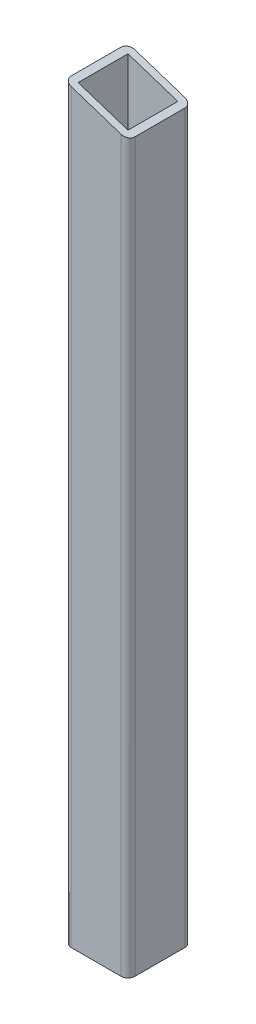
ISO-10303-21;
HEADER;
FILE_DESCRIPTION(('STEP AP214'),'2;1');
FILE_NAME('part.step','',(''),(''),'','','');
FILE_SCHEMA(('AUTOMOTIVE_DESIGN { 1 0 10303 214 1 1 1 1 }'));
ENDSEC;
DATA;
#1=APPLICATION_CONTEXT('core data for automotive mechanical design processes');
#2=APPLICATION_PROTOCOL_DEFINITION('international standard','automotive_design',2000,#1);
#3=PRODUCT_CONTEXT('',#1,'mechanical');
#4=PRODUCT('Part','Part','',(#3));
#5=PRODUCT_RELATED_PRODUCT_CATEGORY('part','',(#4));
#6=PRODUCT_DEFINITION_FORMATION('','',#4);
#7=PRODUCT_DEFINITION_CONTEXT('part definition',#1,'design');
#8=PRODUCT_DEFINITION('design','',#6,#7);
#9=PRODUCT_DEFINITION_SHAPE('','',#8);
#10=(LENGTH_UNIT() NAMED_UNIT(*) SI_UNIT(.MILLI.,.METRE.));
#11=(NAMED_UNIT(*) PLANE_ANGLE_UNIT() SI_UNIT($,.RADIAN.));
#12=(NAMED_UNIT(*) SI_UNIT($,.STERADIAN.) SOLID_ANGLE_UNIT());
#13=UNCERTAINTY_MEASURE_WITH_UNIT(LENGTH_MEASURE(1.E-05),#10,'distance_accuracy_value','');
#14=(GEOMETRIC_REPRESENTATION_CONTEXT(3) GLOBAL_UNCERTAINTY_ASSIGNED_CONTEXT((#13)) GLOBAL_UNIT_ASSIGNED_CONTEXT((#10,
#11,#12)) REPRESENTATION_CONTEXT('',''));
#15=CARTESIAN_POINT('',(0.,0.,0.));
#16=DIRECTION('',(0.,0.,1.));
#17=DIRECTION('',(1.,0.,0.));
#18=AXIS2_PLACEMENT_3D('',#15,#16,#17);
#19=CARTESIAN_POINT('',(22.8,300.25,2.8));
#20=DIRECTION('',(0.,-1.,0.));
#21=DIRECTION('',(0.,0.,-1.));
#22=AXIS2_PLACEMENT_3D('',#19,#20,#21);
#23=CYLINDRICAL_SURFACE('',#22,2.8);
#24=CARTESIAN_POINT('',(22.8,292.780189397286,2.8));
#25=DIRECTION('',(0.311339939031227,0.950298606946276,0.));
#26=DIRECTION('',(0.950298606946276,-0.311339939031227,0.));
#27=AXIS2_PLACEMENT_3D('',#24,#25,#26);
#28=ELLIPSE('',#27,2.94644228617531,2.8);
#29=CARTESIAN_POINT('',(25.6,291.862844235549,2.80000000000002));
#30=VERTEX_POINT('',#29);
#31=CARTESIAN_POINT('',(22.8,292.780189397286,0.));
#32=VERTEX_POINT('',#31);
#33=EDGE_CURVE('E190',#30,#32,#28,.T.);
#34=ORIENTED_EDGE('',*,*,#33,.F.);
#35=DIRECTION('',(0.,-1.,0.));
#36=VECTOR('',#35,1.);
#37=CARTESIAN_POINT('',(25.6,300.25,2.80000000000002));
#38=LINE('',#37,#36);
#39=CARTESIAN_POINT('',(25.6,0.,2.80000000000002));
#40=VERTEX_POINT('',#39);
#41=EDGE_CURVE('E145',#30,#40,#38,.T.);
#42=ORIENTED_EDGE('',*,*,#41,.T.);
#43=CARTESIAN_POINT('',(22.8,0.,2.8));
#44=DIRECTION('',(0.,1.,0.));
#45=DIRECTION('',(0.,0.,-1.));
#46=AXIS2_PLACEMENT_3D('',#43,#44,#45);
#47=CIRCLE('',#46,2.8);
#48=CARTESIAN_POINT('',(22.8,0.,0.));
#49=VERTEX_POINT('',#48);
#50=EDGE_CURVE('E157',#40,#49,#47,.T.);
#51=ORIENTED_EDGE('',*,*,#50,.T.);
#52=DIRECTION('',(0.,-1.,0.));
#53=VECTOR('',#52,1.);
#54=CARTESIAN_POINT('',(22.8,300.25,0.));
#55=LINE('',#54,#53);
#56=EDGE_CURVE('E40',#32,#49,#55,.T.);
#57=ORIENTED_EDGE('',*,*,#56,.F.);
#58=EDGE_LOOP('',(#34,#42,#51,#57));
#59=FACE_BOUND('',#58,.T.);
#60=ADVANCED_FACE('F33',(#59),#23,.T.);
#61=CARTESIAN_POINT('',(2.80000000000002,300.25,0.));
#62=DIRECTION('',(0.,0.,1.));
#63=DIRECTION('',(1.,0.,0.));
#64=AXIS2_PLACEMENT_3D('',#61,#62,#63);
#65=PLANE('',#64);
#66=DIRECTION('',(-0.950298606946276,0.311339939031227,0.));
#67=VECTOR('',#66,1.);
#68=CARTESIAN_POINT('',(2.52858883861931,299.421575451025,0.));
#69=LINE('',#68,#67);
#70=CARTESIAN_POINT('',(2.80000000000002,299.332654838263,0.));
#71=VERTEX_POINT('',#70);
#72=EDGE_CURVE('E47',#32,#71,#69,.T.);
#73=ORIENTED_EDGE('',*,*,#72,.F.);
#74=ORIENTED_EDGE('',*,*,#56,.T.);
#75=DIRECTION('',(-1.,0.,0.));
#76=VECTOR('',#75,1.);
#77=CARTESIAN_POINT('',(2.80000000000002,0.,0.));
#78=LINE('',#77,#76);
#79=CARTESIAN_POINT('',(2.80000000000002,0.,0.));
#80=VERTEX_POINT('',#79);
#81=EDGE_CURVE('E160',#49,#80,#78,.T.);
#82=ORIENTED_EDGE('',*,*,#81,.T.);
#83=DIRECTION('',(0.,-1.,0.));
#84=VECTOR('',#83,1.);
#85=CARTESIAN_POINT('',(2.80000000000002,300.25,0.));
#86=LINE('',#85,#84);
#87=EDGE_CURVE('E179',#71,#80,#86,.T.);
#88=ORIENTED_EDGE('',*,*,#87,.F.);
#89=EDGE_LOOP('',(#73,#74,#82,#88));
#90=FACE_BOUND('',#89,.T.);
#91=ADVANCED_FACE('F181',(#90),#65,.F.);
#92=CARTESIAN_POINT('',(2.8,300.25,2.8));
#93=DIRECTION('',(0.,-1.,0.));
#94=DIRECTION('',(0.,0.,-1.));
#95=AXIS2_PLACEMENT_3D('',#92,#93,#94);
#96=CYLINDRICAL_SURFACE('',#95,2.8);
#97=CARTESIAN_POINT('',(2.8,299.332654838263,2.8));
#98=DIRECTION('',(0.311339939031227,0.950298606946276,0.));
#99=DIRECTION('',(0.950298606946276,-0.311339939031227,0.));
#100=AXIS2_PLACEMENT_3D('',#97,#98,#99);
#101=ELLIPSE('',#100,2.94644228617531,2.8);
#102=CARTESIAN_POINT('',(0.,300.25,2.80000000000002));
#103=VERTEX_POINT('',#102);
#104=EDGE_CURVE('E55',#71,#103,#101,.T.);
#105=ORIENTED_EDGE('',*,*,#104,.F.);
#106=ORIENTED_EDGE('',*,*,#87,.T.);
#107=CARTESIAN_POINT('',(2.8,0.,2.8));
#108=DIRECTION('',(0.,1.,0.));
#109=DIRECTION('',(0.,0.,1.));
#110=AXIS2_PLACEMENT_3D('',#107,#108,#109);
#111=CIRCLE('',#110,2.8);
#112=CARTESIAN_POINT('',(0.,0.,2.80000000000002));
#113=VERTEX_POINT('',#112);
#114=EDGE_CURVE('E164',#80,#113,#111,.T.);
#115=ORIENTED_EDGE('',*,*,#114,.T.);
#116=DIRECTION('',(0.,-1.,0.));
#117=VECTOR('',#116,1.);
#118=CARTESIAN_POINT('',(0.,300.25,2.80000000000002));
#119=LINE('',#118,#117);
#120=EDGE_CURVE('E132',#103,#113,#119,.T.);
#121=ORIENTED_EDGE('',*,*,#120,.F.);
#122=EDGE_LOOP('',(#105,#106,#115,#121));
#123=FACE_BOUND('',#122,.T.);
#124=ADVANCED_FACE('F266',(#123),#96,.T.);
#125=CARTESIAN_POINT('',(2.8,300.25,22.8));
#126=DIRECTION('',(0.,-1.,0.));
#127=DIRECTION('',(0.,0.,-1.));
#128=AXIS2_PLACEMENT_3D('',#125,#126,#127);
#129=CYLINDRICAL_SURFACE('',#128,2.8);
#130=CARTESIAN_POINT('',(2.8,299.332654838263,22.8));
#131=DIRECTION('',(0.311339939031227,0.950298606946276,0.));
#132=DIRECTION('',(0.950298606946276,-0.311339939031227,0.));
#133=AXIS2_PLACEMENT_3D('',#130,#131,#132);
#134=ELLIPSE('',#133,2.94644228617531,2.8);
#135=CARTESIAN_POINT('',(0.,300.25,22.8));
#136=VERTEX_POINT('',#135);
#137=CARTESIAN_POINT('',(2.80000000000002,299.332654838263,25.6));
#138=VERTEX_POINT('',#137);
#139=EDGE_CURVE('E137',#136,#138,#134,.T.);
#140=ORIENTED_EDGE('',*,*,#139,.F.);
#141=DIRECTION('',(0.,-1.,0.));
#142=VECTOR('',#141,1.);
#143=CARTESIAN_POINT('',(0.,300.25,22.8));
#144=LINE('',#143,#142);
#145=CARTESIAN_POINT('',(0.,0.,22.8));
#146=VERTEX_POINT('',#145);
#147=EDGE_CURVE('E121',#136,#146,#144,.T.);
#148=ORIENTED_EDGE('',*,*,#147,.T.);
#149=CARTESIAN_POINT('',(2.8,0.,22.8));
#150=DIRECTION('',(0.,1.,0.));
#151=DIRECTION('',(0.,0.,1.));
#152=AXIS2_PLACEMENT_3D('',#149,#150,#151);
#153=CIRCLE('',#152,2.8);
#154=CARTESIAN_POINT('',(2.80000000000002,0.,25.6));
#155=VERTEX_POINT('',#154);
#156=EDGE_CURVE('E167',#146,#155,#153,.T.);
#157=ORIENTED_EDGE('',*,*,#156,.T.);
#158=DIRECTION('',(0.,-1.,0.));
#159=VECTOR('',#158,1.);
#160=CARTESIAN_POINT('',(2.80000000000002,300.25,25.6));
#161=LINE('',#160,#159);
#162=EDGE_CURVE('E133',#138,#155,#161,.T.);
#163=ORIENTED_EDGE('',*,*,#162,.F.);
#164=EDGE_LOOP('',(#140,#148,#157,#163));
#165=FACE_BOUND('',#164,.T.);
#166=ADVANCED_FACE('F138',(#165),#129,.T.);
#167=CARTESIAN_POINT('',(2.80000000000002,300.25,25.6));
#168=DIRECTION('',(0.,0.,-1.));
#169=DIRECTION('',(-1.,0.,0.));
#170=AXIS2_PLACEMENT_3D('',#167,#168,#169);
#171=PLANE('',#170);
#172=DIRECTION('',(0.950298606946276,-0.311339939031227,0.));
#173=VECTOR('',#172,1.);
#174=CARTESIAN_POINT('',(2.52858883861931,299.421575451025,25.6));
#175=LINE('',#174,#173);
#176=CARTESIAN_POINT('',(22.8,292.780189397286,25.6));
#177=VERTEX_POINT('',#176);
#178=EDGE_CURVE('E141',#138,#177,#175,.T.);
#179=ORIENTED_EDGE('',*,*,#178,.F.);
#180=ORIENTED_EDGE('',*,*,#162,.T.);
#181=DIRECTION('',(1.,0.,0.));
#182=VECTOR('',#181,1.);
#183=CARTESIAN_POINT('',(2.80000000000002,0.,25.6));
#184=LINE('',#183,#182);
#185=CARTESIAN_POINT('',(22.8,0.,25.6));
#186=VERTEX_POINT('',#185);
#187=EDGE_CURVE('E169',#155,#186,#184,.T.);
#188=ORIENTED_EDGE('',*,*,#187,.T.);
#189=DIRECTION('',(0.,-1.,0.));
#190=VECTOR('',#189,1.);
#191=CARTESIAN_POINT('',(22.8,300.25,25.6));
#192=LINE('',#191,#190);
#193=EDGE_CURVE('E175',#177,#186,#192,.T.);
#194=ORIENTED_EDGE('',*,*,#193,.F.);
#195=EDGE_LOOP('',(#179,#180,#188,#194));
#196=FACE_BOUND('',#195,.T.);
#197=ADVANCED_FACE('F202',(#196),#171,.F.);
#198=CARTESIAN_POINT('',(22.8,300.25,22.8));
#199=DIRECTION('',(0.,-1.,0.));
#200=DIRECTION('',(0.,0.,-1.));
#201=AXIS2_PLACEMENT_3D('',#198,#199,#200);
#202=CYLINDRICAL_SURFACE('',#201,2.8);
#203=CARTESIAN_POINT('',(22.8,292.780189397286,22.8));
#204=DIRECTION('',(0.311339939031227,0.950298606946276,0.));
#205=DIRECTION('',(0.950298606946276,-0.311339939031227,0.));
#206=AXIS2_PLACEMENT_3D('',#203,#204,#205);
#207=ELLIPSE('',#206,2.94644228617531,2.8);
#208=CARTESIAN_POINT('',(25.6,291.862844235549,22.8));
#209=VERTEX_POINT('',#208);
#210=EDGE_CURVE('E200',#177,#209,#207,.T.);
#211=ORIENTED_EDGE('',*,*,#210,.F.);
#212=ORIENTED_EDGE('',*,*,#193,.T.);
#213=CARTESIAN_POINT('',(22.8,0.,22.8));
#214=DIRECTION('',(0.,1.,0.));
#215=DIRECTION('',(0.,0.,1.));
#216=AXIS2_PLACEMENT_3D('',#213,#214,#215);
#217=CIRCLE('',#216,2.8);
#218=CARTESIAN_POINT('',(25.6,0.,22.8));
#219=VERTEX_POINT('',#218);
#220=EDGE_CURVE('E151',#186,#219,#217,.T.);
#221=ORIENTED_EDGE('',*,*,#220,.T.);
#222=DIRECTION('',(0.,-1.,0.));
#223=VECTOR('',#222,1.);
#224=CARTESIAN_POINT('',(25.6,300.25,22.8));
#225=LINE('',#224,#223);
#226=EDGE_CURVE('E148',#209,#219,#225,.T.);
#227=ORIENTED_EDGE('',*,*,#226,.F.);
#228=EDGE_LOOP('',(#211,#212,#221,#227));
#229=FACE_BOUND('',#228,.T.);
#230=ADVANCED_FACE('F197',(#229),#202,.T.);
#231=CARTESIAN_POINT('',(25.6,300.25,2.80000000000002));
#232=DIRECTION('',(-1.,0.,0.));
#233=DIRECTION('',(0.,0.,1.));
#234=AXIS2_PLACEMENT_3D('',#231,#232,#233);
#235=PLANE('',#234);
#236=DIRECTION('',(0.,0.,-1.));
#237=VECTOR('',#236,1.);
#238=CARTESIAN_POINT('',(25.6,291.862844235549,429.331047212064));
#239=LINE('',#238,#237);
#240=EDGE_CURVE('E248',#209,#30,#239,.T.);
#241=ORIENTED_EDGE('',*,*,#240,.F.);
#242=ORIENTED_EDGE('',*,*,#226,.T.);
#243=DIRECTION('',(0.,0.,-1.));
#244=VECTOR('',#243,1.);
#245=CARTESIAN_POINT('',(25.6,0.,2.80000000000002));
#246=LINE('',#245,#244);
#247=EDGE_CURVE('E146',#219,#40,#246,.T.);
#248=ORIENTED_EDGE('',*,*,#247,.T.);
#249=ORIENTED_EDGE('',*,*,#41,.F.);
#250=EDGE_LOOP('',(#241,#242,#248,#249));
#251=FACE_BOUND('',#250,.T.);
#252=ADVANCED_FACE('F192',(#251),#235,.F.);
#253=CARTESIAN_POINT('',(22.8,1040.5,2.8));
#254=DIRECTION('',(1.,0.,0.));
#255=DIRECTION('',(0.,0.,-1.));
#256=AXIS2_PLACEMENT_3D('',#253,#254,#255);
#257=PLANE('',#256);
#258=DIRECTION('',(0.,0.,1.));
#259=VECTOR('',#258,1.);
#260=CARTESIAN_POINT('',(22.8,292.780189397286,2.80000000000008));
#261=LINE('',#260,#259);
#262=CARTESIAN_POINT('',(22.8,292.780189397286,2.8));
#263=VERTEX_POINT('',#262);
#264=CARTESIAN_POINT('',(22.8,292.780189397286,22.8));
#265=VERTEX_POINT('',#264);
#266=EDGE_CURVE('E204',#263,#265,#261,.T.);
#267=ORIENTED_EDGE('',*,*,#266,.F.);
#268=DIRECTION('',(0.,-1.,0.));
#269=VECTOR('',#268,1.);
#270=CARTESIAN_POINT('',(22.8,1040.5,2.8));
#271=LINE('',#270,#269);
#272=CARTESIAN_POINT('',(22.8,0.,2.8));
#273=VERTEX_POINT('',#272);
#274=EDGE_CURVE('E161',#263,#273,#271,.T.);
#275=ORIENTED_EDGE('',*,*,#274,.T.);
#276=DIRECTION('',(0.,0.,1.));
#277=VECTOR('',#276,1.);
#278=CARTESIAN_POINT('',(22.8,0.,2.8));
#279=LINE('',#278,#277);
#280=CARTESIAN_POINT('',(22.8,0.,22.8));
#281=VERTEX_POINT('',#280);
#282=EDGE_CURVE('E211',#273,#281,#279,.T.);
#283=ORIENTED_EDGE('',*,*,#282,.T.);
#284=DIRECTION('',(0.,-1.,0.));
#285=VECTOR('',#284,1.);
#286=CARTESIAN_POINT('',(22.8,1040.5,22.8));
#287=LINE('',#286,#285);
#288=EDGE_CURVE('E155',#265,#281,#287,.T.);
#289=ORIENTED_EDGE('',*,*,#288,.F.);
#290=EDGE_LOOP('',(#267,#275,#283,#289));
#291=FACE_BOUND('',#290,.T.);
#292=ADVANCED_FACE('F236',(#291),#257,.F.);
#293=CARTESIAN_POINT('',(2.8,1040.5,2.8));
#294=DIRECTION('',(0.,0.,-1.));
#295=DIRECTION('',(-1.,0.,0.));
#296=AXIS2_PLACEMENT_3D('',#293,#294,#295);
#297=PLANE('',#296);
#298=DIRECTION('',(0.950298606946276,-0.311339939031227,0.));
#299=VECTOR('',#298,1.);
#300=CARTESIAN_POINT('',(-216.486151296571,371.175901241051,2.79999999999996));
#301=LINE('',#300,#299);
#302=CARTESIAN_POINT('',(2.8,299.332654838263,2.8));
#303=VERTEX_POINT('',#302);
#304=EDGE_CURVE('E247',#303,#263,#301,.T.);
#305=ORIENTED_EDGE('',*,*,#304,.F.);
#306=DIRECTION('',(0.,-1.,0.));
#307=VECTOR('',#306,1.);
#308=CARTESIAN_POINT('',(2.8,1040.5,2.8));
#309=LINE('',#308,#307);
#310=CARTESIAN_POINT('',(2.8,0.,2.8));
#311=VERTEX_POINT('',#310);
#312=EDGE_CURVE('E224',#303,#311,#309,.T.);
#313=ORIENTED_EDGE('',*,*,#312,.T.);
#314=DIRECTION('',(1.,0.,0.));
#315=VECTOR('',#314,1.);
#316=CARTESIAN_POINT('',(2.8,0.,2.8));
#317=LINE('',#316,#315);
#318=EDGE_CURVE('E220',#311,#273,#317,.T.);
#319=ORIENTED_EDGE('',*,*,#318,.T.);
#320=ORIENTED_EDGE('',*,*,#274,.F.);
#321=EDGE_LOOP('',(#305,#313,#319,#320));
#322=FACE_BOUND('',#321,.T.);
#323=ADVANCED_FACE('F252',(#322),#297,.F.);
#324=CARTESIAN_POINT('',(2.8,1040.5,2.8));
#325=DIRECTION('',(-1.,0.,0.));
#326=DIRECTION('',(0.,0.,1.));
#327=AXIS2_PLACEMENT_3D('',#324,#325,#326);
#328=PLANE('',#327);
#329=DIRECTION('',(0.,0.,-1.));
#330=VECTOR('',#329,1.);
#331=CARTESIAN_POINT('',(2.8,299.332654838263,2.80000000000007));
#332=LINE('',#331,#330);
#333=CARTESIAN_POINT('',(2.8,299.332654838263,22.8));
#334=VERTEX_POINT('',#333);
#335=EDGE_CURVE('E243',#334,#303,#332,.T.);
#336=ORIENTED_EDGE('',*,*,#335,.F.);
#337=DIRECTION('',(0.,-1.,0.));
#338=VECTOR('',#337,1.);
#339=CARTESIAN_POINT('',(2.8,1040.5,22.8));
#340=LINE('',#339,#338);
#341=CARTESIAN_POINT('',(2.8,0.,22.8));
#342=VERTEX_POINT('',#341);
#343=EDGE_CURVE('E225',#334,#342,#340,.T.);
#344=ORIENTED_EDGE('',*,*,#343,.T.);
#345=DIRECTION('',(0.,0.,-1.));
#346=VECTOR('',#345,1.);
#347=CARTESIAN_POINT('',(2.8,0.,2.8));
#348=LINE('',#347,#346);
#349=EDGE_CURVE('E217',#342,#311,#348,.T.);
#350=ORIENTED_EDGE('',*,*,#349,.T.);
#351=ORIENTED_EDGE('',*,*,#312,.F.);
#352=EDGE_LOOP('',(#336,#344,#350,#351));
#353=FACE_BOUND('',#352,.T.);
#354=ADVANCED_FACE('F241',(#353),#328,.F.);
#355=CARTESIAN_POINT('',(2.8,1040.5,22.8));
#356=DIRECTION('',(0.,0.,1.));
#357=DIRECTION('',(1.,0.,0.));
#358=AXIS2_PLACEMENT_3D('',#355,#356,#357);
#359=PLANE('',#358);
#360=DIRECTION('',(-0.950298606946276,0.311339939031227,0.));
#361=VECTOR('',#360,1.);
#362=CARTESIAN_POINT('',(-216.486151296571,371.175901241051,22.8));
#363=LINE('',#362,#361);
#364=EDGE_CURVE('E11',#265,#334,#363,.T.);
#365=ORIENTED_EDGE('',*,*,#364,.F.);
#366=ORIENTED_EDGE('',*,*,#288,.T.);
#367=DIRECTION('',(-1.,0.,0.));
#368=VECTOR('',#367,1.);
#369=CARTESIAN_POINT('',(2.8,0.,22.8));
#370=LINE('',#369,#368);
#371=EDGE_CURVE('E214',#281,#342,#370,.T.);
#372=ORIENTED_EDGE('',*,*,#371,.T.);
#373=ORIENTED_EDGE('',*,*,#343,.F.);
#374=EDGE_LOOP('',(#365,#366,#372,#373));
#375=FACE_BOUND('',#374,.T.);
#376=ADVANCED_FACE('F230',(#375),#359,.F.);
#377=CARTESIAN_POINT('',(0.,300.25,2.80000000000002));
#378=DIRECTION('',(1.,0.,0.));
#379=DIRECTION('',(0.,0.,-1.));
#380=AXIS2_PLACEMENT_3D('',#377,#378,#379);
#381=PLANE('',#380);
#382=DIRECTION('',(0.,0.,1.));
#383=VECTOR('',#382,1.);
#384=CARTESIAN_POINT('',(0.,0.,2.80000000000002));
#385=LINE('',#384,#383);
#386=EDGE_CURVE('E128',#113,#146,#385,.T.);
#387=ORIENTED_EDGE('',*,*,#386,.T.);
#388=ORIENTED_EDGE('',*,*,#147,.F.);
#389=DIRECTION('',(0.,0.,1.));
#390=VECTOR('',#389,1.);
#391=CARTESIAN_POINT('',(0.,300.25,2.80000000000002));
#392=LINE('',#391,#390);
#393=EDGE_CURVE('E126',#103,#136,#392,.T.);
#394=ORIENTED_EDGE('',*,*,#393,.F.);
#395=ORIENTED_EDGE('',*,*,#120,.T.);
#396=EDGE_LOOP('',(#387,#388,#394,#395));
#397=FACE_BOUND('',#396,.T.);
#398=ADVANCED_FACE('F123',(#397),#381,.F.);
#399=CARTESIAN_POINT('',(22.8,0.,2.8));
#400=DIRECTION('',(0.,-1.,0.));
#401=DIRECTION('',(0.,0.,-1.));
#402=AXIS2_PLACEMENT_3D('',#399,#400,#401);
#403=PLANE('',#402);
#404=ORIENTED_EDGE('',*,*,#282,.F.);
#405=ORIENTED_EDGE('',*,*,#318,.F.);
#406=ORIENTED_EDGE('',*,*,#349,.F.);
#407=ORIENTED_EDGE('',*,*,#371,.F.);
#408=EDGE_LOOP('',(#404,#405,#406,#407));
#409=FACE_BOUND('',#408,.T.);
#410=ORIENTED_EDGE('',*,*,#50,.F.);
#411=ORIENTED_EDGE('',*,*,#247,.F.);
#412=ORIENTED_EDGE('',*,*,#220,.F.);
#413=ORIENTED_EDGE('',*,*,#187,.F.);
#414=ORIENTED_EDGE('',*,*,#156,.F.);
#415=ORIENTED_EDGE('',*,*,#386,.F.);
#416=ORIENTED_EDGE('',*,*,#114,.F.);
#417=ORIENTED_EDGE('',*,*,#81,.F.);
#418=EDGE_LOOP('',(#410,#411,#412,#413,#414,#415,#416,#417));
#419=FACE_BOUND('',#418,.T.);
#420=ADVANCED_FACE('F187',(#409,#419),#403,.T.);
#421=CARTESIAN_POINT('',(0.,300.25,429.331047212064));
#422=DIRECTION('',(0.311339939031227,0.950298606946276,0.));
#423=DIRECTION('',(-0.950298606946276,0.311339939031227,0.));
#424=AXIS2_PLACEMENT_3D('',#421,#422,#423);
#425=PLANE('',#424);
#426=ORIENTED_EDGE('',*,*,#304,.T.);
#427=ORIENTED_EDGE('',*,*,#266,.T.);
#428=ORIENTED_EDGE('',*,*,#364,.T.);
#429=ORIENTED_EDGE('',*,*,#335,.T.);
#430=EDGE_LOOP('',(#426,#427,#428,#429));
#431=FACE_BOUND('',#430,.T.);
#432=ORIENTED_EDGE('',*,*,#240,.T.);
#433=ORIENTED_EDGE('',*,*,#33,.T.);
#434=ORIENTED_EDGE('',*,*,#72,.T.);
#435=ORIENTED_EDGE('',*,*,#104,.T.);
#436=ORIENTED_EDGE('',*,*,#393,.T.);
#437=ORIENTED_EDGE('',*,*,#139,.T.);
#438=ORIENTED_EDGE('',*,*,#178,.T.);
#439=ORIENTED_EDGE('',*,*,#210,.T.);
#440=EDGE_LOOP('',(#432,#433,#434,#435,#436,#437,#438,#439));
#441=FACE_BOUND('',#440,.T.);
#442=ADVANCED_FACE('F144',(#431,#441),#425,.T.);
#443=CLOSED_SHELL('',(#60,#91,#124,#166,#197,#230,#252,#292,#323,#354,#376,#398,#420,#442));
#444=MANIFOLD_SOLID_BREP('B2',#443);
#445=ADVANCED_BREP_SHAPE_REPRESENTATION('',(#18,#444),#14);
#446=SHAPE_DEFINITION_REPRESENTATION(#9,#445);
ENDSEC;
END-ISO-10303-21;
